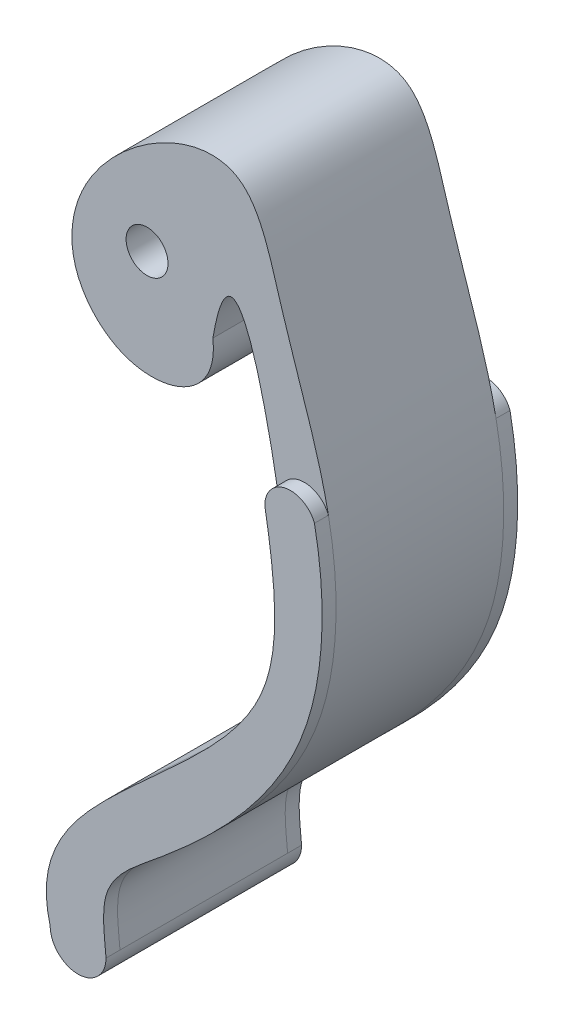
ISO-10303-21;
HEADER;
FILE_DESCRIPTION(('STEP AP214'),'2;1');
FILE_NAME('part.step','',(''),(''),'','','');
FILE_SCHEMA(('AUTOMOTIVE_DESIGN { 1 0 10303 214 1 1 1 1 }'));
ENDSEC;
DATA;
#1=APPLICATION_CONTEXT('core data for automotive mechanical design processes');
#2=APPLICATION_PROTOCOL_DEFINITION('international standard','automotive_design',2000,#1);
#3=PRODUCT_CONTEXT('',#1,'mechanical');
#4=PRODUCT('Part','Part','',(#3));
#5=PRODUCT_RELATED_PRODUCT_CATEGORY('part','',(#4));
#6=PRODUCT_DEFINITION_FORMATION('','',#4);
#7=PRODUCT_DEFINITION_CONTEXT('part definition',#1,'design');
#8=PRODUCT_DEFINITION('design','',#6,#7);
#9=PRODUCT_DEFINITION_SHAPE('','',#8);
#10=(LENGTH_UNIT() NAMED_UNIT(*) SI_UNIT(.MILLI.,.METRE.));
#11=(NAMED_UNIT(*) PLANE_ANGLE_UNIT() SI_UNIT($,.RADIAN.));
#12=(NAMED_UNIT(*) SI_UNIT($,.STERADIAN.) SOLID_ANGLE_UNIT());
#13=UNCERTAINTY_MEASURE_WITH_UNIT(LENGTH_MEASURE(1.E-05),#10,'distance_accuracy_value','');
#14=(GEOMETRIC_REPRESENTATION_CONTEXT(3) GLOBAL_UNCERTAINTY_ASSIGNED_CONTEXT((#13)) GLOBAL_UNIT_ASSIGNED_CONTEXT((#10,
#11,#12)) REPRESENTATION_CONTEXT('',''));
#15=CARTESIAN_POINT('',(0.,0.,0.));
#16=DIRECTION('',(0.,0.,1.));
#17=DIRECTION('',(1.,0.,0.));
#18=AXIS2_PLACEMENT_3D('',#15,#16,#17);
#19=CARTESIAN_POINT('',(8.65256154286827,41.2662872766551,11.9999999999999));
#20=CARTESIAN_POINT('',(9.10118209607456,37.4247396513249,11.9999999999999));
#21=CARTESIAN_POINT('',(3.28528745082989,35.2364508834655,11.9999999999999));
#22=CARTESIAN_POINT('',(-2.16410396939319,40.5397500064075,11.9999999999998));
#23=CARTESIAN_POINT('',(-0.766840168642913,48.981252926085,11.9999999999999));
#24=CARTESIAN_POINT('',(10.8230790933583,55.5956846813032,11.9999999999999));
#25=CARTESIAN_POINT('',(13.2552931019139,46.3870949652313,11.9999999999999));
#26=CARTESIAN_POINT('',(15.2399861624646,40.5537918312876,11.9999999999999));
#27=CARTESIAN_POINT('',(17.86045277101,32.4214527266858,11.9999999999999));
#28=CARTESIAN_POINT('',(17.3867748609505,19.0552244310405,12.));
#29=CARTESIAN_POINT('',(8.96857962727781,10.4709740297987,11.9999999999999));
#30=CARTESIAN_POINT('',(1.34504598361626,4.60786521100223,11.9999999999999));
#31=CARTESIAN_POINT('',(1.90219914305774,1.21580565088503,11.9999999999999));
#32=CARTESIAN_POINT('',(2.00000000000004,0.,11.9999999999998));
#33=B_SPLINE_CURVE_WITH_KNOTS('',3,(#19,#20,#21,#22,#23,#24,#25,#26,#27,#28,#29,#30,#31,#32),
.UNSPECIFIED.,.F.,.F.,(4,1,1,1,1,1,1,1,1,1,1,4),(0.,0.0967638482671301,0.147229163988241,
0.224573311805362,0.354095968697292,0.424863733171627,0.483157365268735,0.569429769338486,
0.705070573129019,0.901237067107306,0.956019997067869,1.),.UNSPECIFIED.);
#34=DIRECTION('',(0.,0.,-0.999999999999998));
#35=VECTOR('',#34,1.);
#36=SURFACE_OF_LINEAR_EXTRUSION('',#33,#35);
#37=CARTESIAN_POINT('',(8.65256154286827,41.2662872766551,0.));
#38=CARTESIAN_POINT('',(9.10118209607455,37.4247396513249,0.));
#39=CARTESIAN_POINT('',(3.28528745082989,35.2364508834655,0.));
#40=CARTESIAN_POINT('',(-2.16410396939319,40.5397500064075,0.));
#41=CARTESIAN_POINT('',(-0.766840168642879,48.981252926085,0.));
#42=CARTESIAN_POINT('',(10.8230790933583,55.5956846813032,0.));
#43=CARTESIAN_POINT('',(13.255293101914,46.3870949652313,-1.11022302462516E-13));
#44=CARTESIAN_POINT('',(15.2399861624646,40.5537918312876,0.));
#45=CARTESIAN_POINT('',(17.86045277101,32.4214527266858,0.));
#46=CARTESIAN_POINT('',(17.3867748609505,19.0552244310405,0.));
#47=CARTESIAN_POINT('',(8.9685796272778,10.4709740297987,0.));
#48=CARTESIAN_POINT('',(1.34504598361626,4.60786521100226,0.));
#49=CARTESIAN_POINT('',(1.90219914305772,1.21580565088503,0.));
#50=CARTESIAN_POINT('',(2.00000000000003,0.,0.));
#51=B_SPLINE_CURVE_WITH_KNOTS('',3,(#37,#38,#39,#40,#41,#42,#43,#44,#45,#46,#47,#48,#49,#50),
.UNSPECIFIED.,.F.,.F.,(4,1,1,1,1,1,1,1,1,1,1,4),(0.,0.0967638482671301,0.147229163988241,
0.224573311805362,0.354095968697292,0.424863733171627,0.483157365268735,0.569429769338486,
0.705070573129019,0.901237067107306,0.956019997067869,1.),.UNSPECIFIED.);
#52=CARTESIAN_POINT('',(8.65256154286827,41.2662872766551,0.));
#53=VERTEX_POINT('',#52);
#54=CARTESIAN_POINT('',(16.92312111311,34.4195411326855,-1.38777878078145E-13));
#55=VERTEX_POINT('',#54);
#56=EDGE_CURVE('E213',#53,#55,#51,.T.);
#57=ORIENTED_EDGE('',*,*,#56,.F.);
#58=DIRECTION('',(0.,0.,-0.999999999999998));
#59=VECTOR('',#58,1.);
#60=CARTESIAN_POINT('',(8.65256154286827,41.2662872766551,11.9999999999999));
#61=LINE('',#60,#59);
#62=CARTESIAN_POINT('',(8.65256154286827,41.2662872766551,11.9999999999999));
#63=VERTEX_POINT('',#62);
#64=EDGE_CURVE('E13',#63,#53,#61,.T.);
#65=ORIENTED_EDGE('',*,*,#64,.F.);
#66=CARTESIAN_POINT('',(16.92312111311,34.4195411326855,11.9999999999999));
#67=VERTEX_POINT('',#66);
#68=EDGE_CURVE('E218',#63,#67,#33,.T.);
#69=ORIENTED_EDGE('',*,*,#68,.T.);
#70=CARTESIAN_POINT('',(16.92312111311,34.4195411326855,11.9999999999999));
#71=CARTESIAN_POINT('',(16.9668608202732,34.1988748763239,12.));
#72=CARTESIAN_POINT('',(17.7710486743882,29.8986507539403,11.9999999999999));
#73=CARTESIAN_POINT('',(17.3867748609535,19.0552244310254,11.9999999999999));
#74=CARTESIAN_POINT('',(8.96857962727752,10.4709740297999,12.));
#75=CARTESIAN_POINT('',(1.34504598361629,4.60786521100209,11.9999999999999));
#76=CARTESIAN_POINT('',(1.90219914305775,1.21580565088508,11.9999999999999));
#77=CARTESIAN_POINT('',(2.00000000000004,0.,11.9999999999998));
#78=B_SPLINE_CURVE_WITH_KNOTS('',3,(#70,#71,#72,#73,#74,#75,#76,#77),.UNSPECIFIED.,.F.,.F.,(4,1,
1,1,1,4),(0.562067606306298,0.569429769338486,0.705070573129019,0.901237067107306,
0.956019997067869,1.),.UNSPECIFIED.);
#79=CARTESIAN_POINT('',(2.00000000000004,0.,11.9999999999998));
#80=VERTEX_POINT('',#79);
#81=EDGE_CURVE('E155',#67,#80,#78,.T.);
#82=ORIENTED_EDGE('',*,*,#81,.T.);
#83=DIRECTION('',(0.,0.,-0.999999999999998));
#84=VECTOR('',#83,1.);
#85=CARTESIAN_POINT('',(2.00000000000004,0.,11.9999999999998));
#86=LINE('',#85,#84);
#87=CARTESIAN_POINT('',(2.00000000000003,0.,0.));
#88=VERTEX_POINT('',#87);
#89=EDGE_CURVE('E144',#80,#88,#86,.T.);
#90=ORIENTED_EDGE('',*,*,#89,.T.);
#91=CARTESIAN_POINT('',(16.92312111311,34.4195411326855,-1.38777878078145E-13));
#92=CARTESIAN_POINT('',(16.9668608202732,34.1988748763239,0.));
#93=CARTESIAN_POINT('',(17.7710486743881,29.8986507539403,-1.11022302462516E-13));
#94=CARTESIAN_POINT('',(17.3867748609535,19.0552244310254,-1.11022302462516E-13));
#95=CARTESIAN_POINT('',(8.96857962727754,10.4709740297999,0.));
#96=CARTESIAN_POINT('',(1.34504598361632,4.60786521100209,0.));
#97=CARTESIAN_POINT('',(1.90219914305772,1.2158056508851,0.));
#98=CARTESIAN_POINT('',(2.00000000000003,0.,0.));
#99=B_SPLINE_CURVE_WITH_KNOTS('',3,(#91,#92,#93,#94,#95,#96,#97,#98),.UNSPECIFIED.,.F.,.F.,(4,1,
1,1,1,4),(0.562067606306298,0.569429769338486,0.705070573129019,0.901237067107306,
0.956019997067869,1.),.UNSPECIFIED.);
#100=EDGE_CURVE('E199',#55,#88,#99,.T.);
#101=ORIENTED_EDGE('',*,*,#100,.F.);
#102=EDGE_LOOP('',(#57,#65,#69,#82,#90,#101));
#103=FACE_BOUND('',#102,.T.);
#104=ADVANCED_FACE('F52',(#103),#36,.T.);
#105=CARTESIAN_POINT('',(-1.99999999999997,0.,12.));
#106=CARTESIAN_POINT('',(-3.14094019365851,4.21599928477223,11.9999999999999));
#107=CARTESIAN_POINT('',(2.89729936693877,11.4588662737259,12.));
#108=CARTESIAN_POINT('',(14.6453699190701,20.2351922359558,11.9999999999999));
#109=CARTESIAN_POINT('',(14.1319176735092,32.4953004574275,12.));
#110=CARTESIAN_POINT('',(10.0181578199574,49.4039756935857,12.));
#111=CARTESIAN_POINT('',(8.65256154286827,41.2662872766551,11.9999999999999));
#112=B_SPLINE_CURVE_WITH_KNOTS('',3,(#105,#106,#107,#108,#109,#110,#111),.UNSPECIFIED.,.F.,.F.,
(4,1,1,1,4),(0.,0.216144602550126,0.503172390505124,0.73063678352281,1.),.UNSPECIFIED.);
#113=DIRECTION('',(0.,0.,-0.999999999999998));
#114=VECTOR('',#113,1.);
#115=SURFACE_OF_LINEAR_EXTRUSION('',#112,#114);
#116=CARTESIAN_POINT('',(-1.99999999999997,0.,-1.11022302462516E-13));
#117=CARTESIAN_POINT('',(-3.14094019365852,4.21599928477224,-1.38777878078145E-13));
#118=CARTESIAN_POINT('',(2.89729936693879,11.4588662737259,0.));
#119=CARTESIAN_POINT('',(14.6453699190701,20.2351922359557,-1.38777878078145E-13));
#120=CARTESIAN_POINT('',(14.1319176735092,32.4953004574275,0.));
#121=CARTESIAN_POINT('',(10.0181578199574,49.4039756935856,0.));
#122=CARTESIAN_POINT('',(8.65256154286827,41.2662872766551,0.));
#123=B_SPLINE_CURVE_WITH_KNOTS('',3,(#116,#117,#118,#119,#120,#121,#122),.UNSPECIFIED.,.F.,.F.,
(4,1,1,1,4),(0.,0.216144602550126,0.503172390505124,0.73063678352281,1.),.UNSPECIFIED.);
#124=CARTESIAN_POINT('',(-1.99999999999997,0.,-1.11022302462516E-13));
#125=VERTEX_POINT('',#124);
#126=CARTESIAN_POINT('',(13.3652867250912,33.7553815174871,0.));
#127=VERTEX_POINT('',#126);
#128=EDGE_CURVE('E76',#125,#127,#123,.T.);
#129=ORIENTED_EDGE('',*,*,#128,.F.);
#130=DIRECTION('',(0.,0.,-0.999999999999998));
#131=VECTOR('',#130,1.);
#132=CARTESIAN_POINT('',(-1.99999999999997,0.,12.));
#133=LINE('',#132,#131);
#134=CARTESIAN_POINT('',(-1.99999999999997,0.,12.));
#135=VERTEX_POINT('',#134);
#136=EDGE_CURVE('E61',#135,#125,#133,.T.);
#137=ORIENTED_EDGE('',*,*,#136,.F.);
#138=CARTESIAN_POINT('',(13.3652867250913,33.7553815174871,11.9999999999999));
#139=VERTEX_POINT('',#138);
#140=EDGE_CURVE('E224',#135,#139,#112,.T.);
#141=ORIENTED_EDGE('',*,*,#140,.T.);
#142=EDGE_CURVE('E223',#139,#63,#112,.T.);
#143=ORIENTED_EDGE('',*,*,#142,.T.);
#144=ORIENTED_EDGE('',*,*,#64,.T.);
#145=EDGE_CURVE('E283',#127,#53,#123,.T.);
#146=ORIENTED_EDGE('',*,*,#145,.F.);
#147=EDGE_LOOP('',(#129,#137,#141,#143,#144,#146));
#148=FACE_BOUND('',#147,.T.);
#149=ADVANCED_FACE('F238',(#148),#115,.T.);
#150=CARTESIAN_POINT('',(0.,0.,11.9999999999999));
#151=DIRECTION('',(0.,0.,-0.999999999999998));
#152=DIRECTION('',(-1.,0.,0.));
#153=AXIS2_PLACEMENT_3D('',#150,#151,#152);
#154=CYLINDRICAL_SURFACE('',#153,2.);
#155=ORIENTED_EDGE('',*,*,#136,.T.);
#156=DIRECTION('',(0.,0.,0.999999999999998));
#157=VECTOR('',#156,1.);
#158=CARTESIAN_POINT('',(-1.99999999999997,0.,-1.00000000000006));
#159=LINE('',#158,#157);
#160=CARTESIAN_POINT('',(-1.99999999999997,0.,-1.00000000000006));
#161=VERTEX_POINT('',#160);
#162=EDGE_CURVE('E214',#161,#125,#159,.T.);
#163=ORIENTED_EDGE('',*,*,#162,.F.);
#164=CARTESIAN_POINT('',(0.,0.,-1.00000000000008));
#165=DIRECTION('',(0.,0.,0.999999999999998));
#166=DIRECTION('',(1.,0.,0.));
#167=AXIS2_PLACEMENT_3D('',#164,#165,#166);
#168=CIRCLE('',#167,2.);
#169=CARTESIAN_POINT('',(2.00000000000003,0.,-1.00000000000006));
#170=VERTEX_POINT('',#169);
#171=EDGE_CURVE('E190',#161,#170,#168,.T.);
#172=ORIENTED_EDGE('',*,*,#171,.T.);
#173=DIRECTION('',(0.,0.,0.999999999999998));
#174=VECTOR('',#173,1.);
#175=CARTESIAN_POINT('',(2.00000000000003,0.,-1.00000000000006));
#176=LINE('',#175,#174);
#177=EDGE_CURVE('E211',#170,#88,#176,.T.);
#178=ORIENTED_EDGE('',*,*,#177,.T.);
#179=ORIENTED_EDGE('',*,*,#89,.F.);
#180=DIRECTION('',(0.,0.,-0.999999999999998));
#181=VECTOR('',#180,1.);
#182=CARTESIAN_POINT('',(2.00000000000006,0.,12.9999999999999));
#183=LINE('',#182,#181);
#184=CARTESIAN_POINT('',(2.00000000000006,0.,12.9999999999999));
#185=VERTEX_POINT('',#184);
#186=EDGE_CURVE('E140',#185,#80,#183,.T.);
#187=ORIENTED_EDGE('',*,*,#186,.F.);
#188=CARTESIAN_POINT('',(0.,0.,12.9999999999999));
#189=DIRECTION('',(0.,0.,0.999999999999998));
#190=DIRECTION('',(1.,0.,0.));
#191=AXIS2_PLACEMENT_3D('',#188,#189,#190);
#192=CIRCLE('',#191,2.);
#193=CARTESIAN_POINT('',(-1.99999999999995,0.,12.9999999999999));
#194=VERTEX_POINT('',#193);
#195=EDGE_CURVE('E128',#194,#185,#192,.T.);
#196=ORIENTED_EDGE('',*,*,#195,.F.);
#197=DIRECTION('',(0.,0.,-0.999999999999998));
#198=VECTOR('',#197,1.);
#199=CARTESIAN_POINT('',(-1.99999999999995,0.,12.9999999999999));
#200=LINE('',#199,#198);
#201=EDGE_CURVE('E147',#194,#135,#200,.T.);
#202=ORIENTED_EDGE('',*,*,#201,.T.);
#203=EDGE_LOOP('',(#155,#163,#172,#178,#179,#187,#196,#202));
#204=FACE_BOUND('',#203,.T.);
#205=ADVANCED_FACE('F142',(#204),#154,.T.);
#206=CARTESIAN_POINT('',(0.,0.,11.9999999999999));
#207=DIRECTION('',(0.,0.,0.999999999999998));
#208=DIRECTION('',(1.,0.,0.));
#209=AXIS2_PLACEMENT_3D('',#206,#207,#208);
#210=PLANE('',#209);
#211=CARTESIAN_POINT('',(3.93743851983308,44.2868002055946,11.9999999999999));
#212=DIRECTION('',(0.,0.,0.999999999999998));
#213=DIRECTION('',(1.,0.,0.));
#214=AXIS2_PLACEMENT_3D('',#211,#212,#213);
#215=CIRCLE('',#214,1.5);
#216=CARTESIAN_POINT('',(2.43743851983306,44.2868002055946,11.9999999999999));
#217=VERTEX_POINT('',#216);
#218=EDGE_CURVE('E161',#217,#217,#215,.F.);
#219=ORIENTED_EDGE('',*,*,#218,.T.);
#220=EDGE_LOOP('',(#219));
#221=FACE_BOUND('',#220,.T.);
#222=CARTESIAN_POINT('',(15.2061949993972,33.7553815174883,11.9999999999999));
#223=DIRECTION('',(0.,0.,0.999999999999998));
#224=DIRECTION('',(1.,0.,0.));
#225=AXIS2_PLACEMENT_3D('',#222,#223,#224);
#226=CIRCLE('',#225,1.84090827430589);
#227=EDGE_CURVE('E68',#67,#139,#226,.T.);
#228=ORIENTED_EDGE('',*,*,#227,.F.);
#229=ORIENTED_EDGE('',*,*,#68,.F.);
#230=ORIENTED_EDGE('',*,*,#142,.F.);
#231=EDGE_LOOP('',(#228,#229,#230));
#232=FACE_BOUND('',#231,.T.);
#233=ADVANCED_FACE('F244',(#221,#232),#210,.T.);
#234=CARTESIAN_POINT('',(0.,0.,0.));
#235=DIRECTION('',(0.,0.,0.999999999999998));
#236=DIRECTION('',(1.,0.,0.));
#237=AXIS2_PLACEMENT_3D('',#234,#235,#236);
#238=PLANE('',#237);
#239=CARTESIAN_POINT('',(3.93743851983303,44.2868002055946,0.));
#240=DIRECTION('',(0.,0.,0.999999999999998));
#241=DIRECTION('',(1.,0.,0.));
#242=AXIS2_PLACEMENT_3D('',#239,#240,#241);
#243=CIRCLE('',#242,1.5);
#244=CARTESIAN_POINT('',(2.43743851983306,44.2868002055946,0.));
#245=VERTEX_POINT('',#244);
#246=EDGE_CURVE('E56',#245,#245,#243,.F.);
#247=ORIENTED_EDGE('',*,*,#246,.F.);
#248=EDGE_LOOP('',(#247));
#249=FACE_BOUND('',#248,.T.);
#250=ORIENTED_EDGE('',*,*,#56,.T.);
#251=CARTESIAN_POINT('',(15.2061949993972,33.7553815174883,-1.38777878078145E-13));
#252=DIRECTION('',(0.,0.,0.999999999999998));
#253=DIRECTION('',(1.,0.,0.));
#254=AXIS2_PLACEMENT_3D('',#251,#252,#253);
#255=CIRCLE('',#254,1.84090827430589);
#256=EDGE_CURVE('E204',#55,#127,#255,.T.);
#257=ORIENTED_EDGE('',*,*,#256,.T.);
#258=ORIENTED_EDGE('',*,*,#145,.T.);
#259=EDGE_LOOP('',(#250,#257,#258));
#260=FACE_BOUND('',#259,.T.);
#261=ADVANCED_FACE('F245',(#249,#260),#238,.F.);
#262=CARTESIAN_POINT('',(16.92312111311,34.4195411326855,-1.00000000000011));
#263=CARTESIAN_POINT('',(16.9668608202732,34.1988748763239,-1.00000000000006));
#264=CARTESIAN_POINT('',(17.7710486743882,29.8986507539402,-1.00000000000006));
#265=CARTESIAN_POINT('',(17.3867748609535,19.0552244310254,-1.00000000000006));
#266=CARTESIAN_POINT('',(8.96857962727755,10.4709740297999,-1.00000000000003));
#267=CARTESIAN_POINT('',(1.3450459836163,4.60786521100209,-1.00000000000006));
#268=CARTESIAN_POINT('',(1.90219914305775,1.21580565088511,-1.00000000000008));
#269=CARTESIAN_POINT('',(2.00000000000003,0.,-1.00000000000006));
#270=B_SPLINE_CURVE_WITH_KNOTS('',3,(#262,#263,#264,#265,#266,#267,#268,#269),.UNSPECIFIED.,.F.,
.F.,(4,1,1,1,1,4),(0.562067606306298,0.569429769338486,0.705070573129019,0.901237067107306,
0.956019997067869,1.),.UNSPECIFIED.);
#271=DIRECTION('',(0.,0.,0.999999999999998));
#272=VECTOR('',#271,1.);
#273=SURFACE_OF_LINEAR_EXTRUSION('',#270,#272);
#274=ORIENTED_EDGE('',*,*,#100,.T.);
#275=ORIENTED_EDGE('',*,*,#177,.F.);
#276=CARTESIAN_POINT('',(16.92312111311,34.4195411326855,-1.00000000000011));
#277=VERTEX_POINT('',#276);
#278=EDGE_CURVE('E210',#277,#170,#270,.T.);
#279=ORIENTED_EDGE('',*,*,#278,.F.);
#280=DIRECTION('',(0.,0.,0.999999999999998));
#281=VECTOR('',#280,1.);
#282=CARTESIAN_POINT('',(16.92312111311,34.4195411326855,-1.00000000000011));
#283=LINE('',#282,#281);
#284=EDGE_CURVE('E198',#277,#55,#283,.T.);
#285=ORIENTED_EDGE('',*,*,#284,.T.);
#286=EDGE_LOOP('',(#274,#275,#279,#285));
#287=FACE_BOUND('',#286,.T.);
#288=ADVANCED_FACE('F182',(#287),#273,.F.);
#289=CARTESIAN_POINT('',(-1.99999999999997,0.,-1.00000000000006));
#290=CARTESIAN_POINT('',(-3.14094019365846,4.21599928477167,-1.00000000000006));
#291=CARTESIAN_POINT('',(2.89729936693829,11.4588662737291,-1.00000000000011));
#292=CARTESIAN_POINT('',(14.6453699190677,20.2351922359404,-1.00000000000003));
#293=CARTESIAN_POINT('',(14.3083598448832,28.2822501988861,-1.00000000000006));
#294=CARTESIAN_POINT('',(13.3652867250913,33.7553815174872,-1.00000000000008));
#295=B_SPLINE_CURVE_WITH_KNOTS('',3,(#289,#290,#291,#292,#293,#294),.UNSPECIFIED.,.F.,.F.,(4,1,
1,4),(0.,0.216144602550126,0.503172390505124,0.730636783522535),.UNSPECIFIED.);
#296=DIRECTION('',(0.,0.,0.999999999999998));
#297=VECTOR('',#296,1.);
#298=SURFACE_OF_LINEAR_EXTRUSION('',#295,#297);
#299=ORIENTED_EDGE('',*,*,#128,.T.);
#300=DIRECTION('',(0.,0.,0.999999999999998));
#301=VECTOR('',#300,1.);
#302=CARTESIAN_POINT('',(13.3652867250913,33.7553815174872,-1.00000000000008));
#303=LINE('',#302,#301);
#304=CARTESIAN_POINT('',(13.3652867250913,33.7553815174872,-1.00000000000008));
#305=VERTEX_POINT('',#304);
#306=EDGE_CURVE('E216',#305,#127,#303,.T.);
#307=ORIENTED_EDGE('',*,*,#306,.F.);
#308=EDGE_CURVE('E184',#161,#305,#295,.T.);
#309=ORIENTED_EDGE('',*,*,#308,.F.);
#310=ORIENTED_EDGE('',*,*,#162,.T.);
#311=EDGE_LOOP('',(#299,#307,#309,#310));
#312=FACE_BOUND('',#311,.T.);
#313=ADVANCED_FACE('F178',(#312),#298,.F.);
#314=CARTESIAN_POINT('',(15.2061949993972,33.7553815174883,-1.00000000000008));
#315=DIRECTION('',(0.,0.,0.999999999999998));
#316=DIRECTION('',(1.,0.,0.));
#317=AXIS2_PLACEMENT_3D('',#314,#315,#316);
#318=CYLINDRICAL_SURFACE('',#317,1.84090827430589);
#319=ORIENTED_EDGE('',*,*,#256,.F.);
#320=ORIENTED_EDGE('',*,*,#284,.F.);
#321=CARTESIAN_POINT('',(15.2061949993972,33.7553815174883,-1.00000000000008));
#322=DIRECTION('',(0.,0.,0.999999999999998));
#323=DIRECTION('',(1.,0.,0.));
#324=AXIS2_PLACEMENT_3D('',#321,#322,#323);
#325=CIRCLE('',#324,1.84090827430589);
#326=EDGE_CURVE('E191',#277,#305,#325,.T.);
#327=ORIENTED_EDGE('',*,*,#326,.T.);
#328=ORIENTED_EDGE('',*,*,#306,.T.);
#329=EDGE_LOOP('',(#319,#320,#327,#328));
#330=FACE_BOUND('',#329,.T.);
#331=ADVANCED_FACE('F176',(#330),#318,.T.);
#332=CARTESIAN_POINT('',(0.,0.,-1.00000000000008));
#333=DIRECTION('',(0.,0.,0.999999999999998));
#334=DIRECTION('',(1.,0.,0.));
#335=AXIS2_PLACEMENT_3D('',#332,#333,#334);
#336=PLANE('',#335);
#337=ORIENTED_EDGE('',*,*,#278,.T.);
#338=ORIENTED_EDGE('',*,*,#171,.F.);
#339=ORIENTED_EDGE('',*,*,#308,.T.);
#340=ORIENTED_EDGE('',*,*,#326,.F.);
#341=EDGE_LOOP('',(#337,#338,#339,#340));
#342=FACE_BOUND('',#341,.T.);
#343=ADVANCED_FACE('F171',(#342),#336,.F.);
#344=CARTESIAN_POINT('',(16.92312111311,34.4195411326855,12.9999999999999));
#345=CARTESIAN_POINT('',(16.9668608202732,34.198874876324,13.));
#346=CARTESIAN_POINT('',(17.7710486743882,29.8986507539403,12.9999999999999));
#347=CARTESIAN_POINT('',(17.3867748609535,19.0552244310254,12.9999999999999));
#348=CARTESIAN_POINT('',(8.96857962727751,10.4709740297999,12.9999999999999));
#349=CARTESIAN_POINT('',(1.34504598361627,4.60786521100208,12.9999999999999));
#350=CARTESIAN_POINT('',(1.90219914305773,1.21580565088508,12.9999999999999));
#351=CARTESIAN_POINT('',(2.00000000000006,0.,12.9999999999999));
#352=B_SPLINE_CURVE_WITH_KNOTS('',3,(#344,#345,#346,#347,#348,#349,#350,#351),.UNSPECIFIED.,.F.,
.F.,(4,1,1,1,1,4),(0.562067606306298,0.569429769338486,0.705070573129019,0.901237067107306,
0.956019997067869,1.),.UNSPECIFIED.);
#353=DIRECTION('',(0.,0.,-0.999999999999998));
#354=VECTOR('',#353,1.);
#355=SURFACE_OF_LINEAR_EXTRUSION('',#352,#354);
#356=ORIENTED_EDGE('',*,*,#81,.F.);
#357=DIRECTION('',(0.,0.,-0.999999999999998));
#358=VECTOR('',#357,1.);
#359=CARTESIAN_POINT('',(16.92312111311,34.4195411326855,12.9999999999999));
#360=LINE('',#359,#358);
#361=CARTESIAN_POINT('',(16.92312111311,34.4195411326855,12.9999999999999));
#362=VERTEX_POINT('',#361);
#363=EDGE_CURVE('E152',#362,#67,#360,.T.);
#364=ORIENTED_EDGE('',*,*,#363,.F.);
#365=EDGE_CURVE('E132',#362,#185,#352,.T.);
#366=ORIENTED_EDGE('',*,*,#365,.T.);
#367=ORIENTED_EDGE('',*,*,#186,.T.);
#368=EDGE_LOOP('',(#356,#364,#366,#367));
#369=FACE_BOUND('',#368,.T.);
#370=ADVANCED_FACE('F150',(#369),#355,.T.);
#371=CARTESIAN_POINT('',(15.2061949993972,33.7553815174883,12.9999999999999));
#372=DIRECTION('',(0.,0.,-0.999999999999998));
#373=DIRECTION('',(-1.,0.,0.));
#374=AXIS2_PLACEMENT_3D('',#371,#372,#373);
#375=CYLINDRICAL_SURFACE('',#374,1.84090827430589);
#376=ORIENTED_EDGE('',*,*,#227,.T.);
#377=DIRECTION('',(0.,0.,-0.999999999999998));
#378=VECTOR('',#377,1.);
#379=CARTESIAN_POINT('',(13.3652867250913,33.7553815174872,12.9999999999998));
#380=LINE('',#379,#378);
#381=CARTESIAN_POINT('',(13.3652867250913,33.7553815174872,12.9999999999998));
#382=VERTEX_POINT('',#381);
#383=EDGE_CURVE('E261',#382,#139,#380,.T.);
#384=ORIENTED_EDGE('',*,*,#383,.F.);
#385=CARTESIAN_POINT('',(15.2061949993972,33.7553815174883,12.9999999999999));
#386=DIRECTION('',(0.,0.,0.999999999999998));
#387=DIRECTION('',(1.,0.,0.));
#388=AXIS2_PLACEMENT_3D('',#385,#386,#387);
#389=CIRCLE('',#388,1.84090827430589);
#390=EDGE_CURVE('E148',#362,#382,#389,.T.);
#391=ORIENTED_EDGE('',*,*,#390,.F.);
#392=ORIENTED_EDGE('',*,*,#363,.T.);
#393=EDGE_LOOP('',(#376,#384,#391,#392));
#394=FACE_BOUND('',#393,.T.);
#395=ADVANCED_FACE('F170',(#394),#375,.T.);
#396=CARTESIAN_POINT('',(-1.99999999999995,0.,12.9999999999999));
#397=CARTESIAN_POINT('',(-3.14094019365841,4.21599928477167,12.9999999999999));
#398=CARTESIAN_POINT('',(2.89729936693827,11.4588662737291,12.9999999999999));
#399=CARTESIAN_POINT('',(14.6453699190677,20.2351922359404,13.));
#400=CARTESIAN_POINT('',(14.3083598448832,28.282250198886,13.));
#401=CARTESIAN_POINT('',(13.3652867250913,33.7553815174872,12.9999999999998));
#402=B_SPLINE_CURVE_WITH_KNOTS('',3,(#396,#397,#398,#399,#400,#401),.UNSPECIFIED.,.F.,.F.,(4,1,
1,4),(0.,0.216144602550126,0.503172390505124,0.730636783522535),.UNSPECIFIED.);
#403=DIRECTION('',(0.,0.,-0.999999999999998));
#404=VECTOR('',#403,1.);
#405=SURFACE_OF_LINEAR_EXTRUSION('',#402,#404);
#406=ORIENTED_EDGE('',*,*,#140,.F.);
#407=ORIENTED_EDGE('',*,*,#201,.F.);
#408=EDGE_CURVE('E134',#194,#382,#402,.T.);
#409=ORIENTED_EDGE('',*,*,#408,.T.);
#410=ORIENTED_EDGE('',*,*,#383,.T.);
#411=EDGE_LOOP('',(#406,#407,#409,#410));
#412=FACE_BOUND('',#411,.T.);
#413=ADVANCED_FACE('F172',(#412),#405,.T.);
#414=CARTESIAN_POINT('',(0.,0.,12.9999999999999));
#415=DIRECTION('',(0.,0.,-0.999999999999998));
#416=DIRECTION('',(1.,0.,0.));
#417=AXIS2_PLACEMENT_3D('',#414,#415,#416);
#418=PLANE('',#417);
#419=ORIENTED_EDGE('',*,*,#365,.F.);
#420=ORIENTED_EDGE('',*,*,#390,.T.);
#421=ORIENTED_EDGE('',*,*,#408,.F.);
#422=ORIENTED_EDGE('',*,*,#195,.T.);
#423=EDGE_LOOP('',(#419,#420,#421,#422));
#424=FACE_BOUND('',#423,.T.);
#425=ADVANCED_FACE('F130',(#424),#418,.F.);
#426=CARTESIAN_POINT('',(3.93743851983306,44.2868002055946,12.9999999999999));
#427=DIRECTION('',(0.,0.,-0.999999999999998));
#428=DIRECTION('',(-1.,0.,0.));
#429=AXIS2_PLACEMENT_3D('',#426,#427,#428);
#430=CYLINDRICAL_SURFACE('',#429,1.5);
#431=CARTESIAN_POINT('',(2.43743851983306,44.2868002055946,11.9999999999999));
#432=CARTESIAN_POINT('',(2.43743851983306,44.2868002055946,11.8749999999999));
#433=CARTESIAN_POINT('',(2.43743851983306,44.2868002055946,11.7499999999999));
#434=CARTESIAN_POINT('',(2.43743851983306,44.2868002055946,11.4999999999999));
#435=CARTESIAN_POINT('',(2.43743851983306,44.2868002055946,11.3749999999999));
#436=CARTESIAN_POINT('',(2.43743851983306,44.2868002055946,11.1249999999999));
#437=CARTESIAN_POINT('',(2.43743851983306,44.2868002055946,10.9999999999999));
#438=CARTESIAN_POINT('',(2.43743851983306,44.2868002055946,10.7499999999999));
#439=CARTESIAN_POINT('',(2.43743851983306,44.2868002055946,10.6249999999999));
#440=CARTESIAN_POINT('',(2.43743851983306,44.2868002055946,10.3749999999999));
#441=CARTESIAN_POINT('',(2.43743851983306,44.2868002055946,10.2499999999999));
#442=CARTESIAN_POINT('',(2.43743851983306,44.2868002055946,9.9999999999999));
#443=CARTESIAN_POINT('',(2.43743851983306,44.2868002055946,9.8749999999999));
#444=CARTESIAN_POINT('',(2.43743851983306,44.2868002055946,9.6249999999999));
#445=CARTESIAN_POINT('',(2.43743851983306,44.2868002055946,9.4999999999999));
#446=CARTESIAN_POINT('',(2.43743851983306,44.2868002055946,9.2499999999999));
#447=CARTESIAN_POINT('',(2.43743851983306,44.2868002055946,9.1249999999999));
#448=CARTESIAN_POINT('',(2.43743851983306,44.2868002055946,8.8749999999999));
#449=CARTESIAN_POINT('',(2.43743851983306,44.2868002055946,8.74999999999991));
#450=CARTESIAN_POINT('',(2.43743851983306,44.2868002055946,8.49999999999991));
#451=CARTESIAN_POINT('',(2.43743851983306,44.2868002055946,8.37499999999991));
#452=CARTESIAN_POINT('',(2.43743851983306,44.2868002055946,8.12499999999991));
#453=CARTESIAN_POINT('',(2.43743851983306,44.2868002055946,7.99999999999991));
#454=CARTESIAN_POINT('',(2.43743851983306,44.2868002055946,7.74999999999991));
#455=CARTESIAN_POINT('',(2.43743851983306,44.2868002055946,7.62499999999991));
#456=CARTESIAN_POINT('',(2.43743851983306,44.2868002055946,7.37499999999991));
#457=CARTESIAN_POINT('',(2.43743851983306,44.2868002055946,7.24999999999991));
#458=CARTESIAN_POINT('',(2.43743851983306,44.2868002055946,6.99999999999991));
#459=CARTESIAN_POINT('',(2.43743851983306,44.2868002055946,6.87499999999991));
#460=CARTESIAN_POINT('',(2.43743851983306,44.2868002055946,6.62499999999991));
#461=CARTESIAN_POINT('',(2.43743851983306,44.2868002055946,6.49999999999991));
#462=CARTESIAN_POINT('',(2.43743851983306,44.2868002055946,6.24999999999991));
#463=CARTESIAN_POINT('',(2.43743851983306,44.2868002055946,6.12499999999991));
#464=CARTESIAN_POINT('',(2.43743851983306,44.2868002055946,5.87499999999991));
#465=CARTESIAN_POINT('',(2.43743851983306,44.2868002055946,5.74999999999991));
#466=CARTESIAN_POINT('',(2.43743851983306,44.2868002055946,5.49999999999991));
#467=CARTESIAN_POINT('',(2.43743851983306,44.2868002055946,5.37499999999991));
#468=CARTESIAN_POINT('',(2.43743851983306,44.2868002055946,5.12499999999991));
#469=CARTESIAN_POINT('',(2.43743851983306,44.2868002055946,4.99999999999991));
#470=CARTESIAN_POINT('',(2.43743851983306,44.2868002055946,4.74999999999991));
#471=CARTESIAN_POINT('',(2.43743851983306,44.2868002055946,4.62499999999991));
#472=CARTESIAN_POINT('',(2.43743851983306,44.2868002055946,4.37499999999991));
#473=CARTESIAN_POINT('',(2.43743851983306,44.2868002055946,4.24999999999991));
#474=CARTESIAN_POINT('',(2.43743851983306,44.2868002055946,3.99999999999991));
#475=CARTESIAN_POINT('',(2.43743851983306,44.2868002055946,3.87499999999991));
#476=CARTESIAN_POINT('',(2.43743851983306,44.2868002055946,3.62499999999991));
#477=CARTESIAN_POINT('',(2.43743851983306,44.2868002055946,3.49999999999991));
#478=CARTESIAN_POINT('',(2.43743851983306,44.2868002055946,3.24999999999991));
#479=CARTESIAN_POINT('',(2.43743851983306,44.2868002055946,3.12499999999991));
#480=CARTESIAN_POINT('',(2.43743851983306,44.2868002055946,2.87499999999991));
#481=CARTESIAN_POINT('',(2.43743851983306,44.2868002055946,2.74999999999991));
#482=CARTESIAN_POINT('',(2.43743851983306,44.2868002055946,2.49999999999991));
#483=CARTESIAN_POINT('',(2.43743851983306,44.2868002055946,2.37499999999991));
#484=CARTESIAN_POINT('',(2.43743851983306,44.2868002055946,2.12499999999991));
#485=CARTESIAN_POINT('',(2.43743851983306,44.2868002055946,1.99999999999991));
#486=CARTESIAN_POINT('',(2.43743851983306,44.2868002055946,1.74999999999991));
#487=CARTESIAN_POINT('',(2.43743851983306,44.2868002055946,1.62499999999992));
#488=CARTESIAN_POINT('',(2.43743851983306,44.2868002055946,1.37499999999992));
#489=CARTESIAN_POINT('',(2.43743851983306,44.2868002055946,1.24999999999992));
#490=CARTESIAN_POINT('',(2.43743851983306,44.2868002055946,0.999999999999918));
#491=CARTESIAN_POINT('',(2.43743851983306,44.2868002055946,0.874999999999919));
#492=CARTESIAN_POINT('',(2.43743851983306,44.2868002055946,0.624999999999919));
#493=CARTESIAN_POINT('',(2.43743851983306,44.2868002055946,0.499999999999919));
#494=CARTESIAN_POINT('',(2.43743851983306,44.2868002055946,0.249999999999919));
#495=CARTESIAN_POINT('',(2.43743851983306,44.2868002055946,0.124999999999919));
#496=CARTESIAN_POINT('',(2.43743851983306,44.2868002055946,0.));
#497=B_SPLINE_CURVE_WITH_KNOTS('',3,(#431,#432,#433,#434,#435,#436,#437,#438,#439,#440,#441,
#442,#443,#444,#445,#446,#447,#448,#449,#450,#451,#452,#453,#454,#455,#456,#457,#458,#459,#460,
#461,#462,#463,#464,#465,#466,#467,#468,#469,#470,#471,#472,#473,#474,#475,#476,#477,#478,#479,
#480,#481,#482,#483,#484,#485,#486,#487,#488,#489,#490,#491,#492,#493,#494,#495,#496),
.UNSPECIFIED.,.F.,.F.,(4,2,2,2,2,2,2,2,2,2,2,2,2,2,2,2,2,2,2,2,2,2,2,2,2,2,2,2,2,2,2,2,4),(0.,
0.374999999999999,0.749999999999997,1.125,1.5,1.875,2.25,2.625,3.,3.37499999999999,
3.74999999999999,4.12499999999999,4.49999999999999,4.87499999999999,5.24999999999999,
5.62499999999999,5.99999999999999,6.37499999999999,6.74999999999999,7.12499999999999,
7.49999999999999,7.87499999999999,8.24999999999999,8.62499999999999,8.99999999999999,
9.37499999999999,9.74999999999999,10.125,10.5,10.875,11.25,11.625,12.),.UNSPECIFIED.);
#498=EDGE_CURVE('BSEAM357',#217,#245,#497,.T.);
#499=ORIENTED_EDGE('',*,*,#218,.F.);
#500=ORIENTED_EDGE('',*,*,#246,.T.);
#501=ORIENTED_EDGE('',*,*,#498,.T.);
#502=ORIENTED_EDGE('',*,*,#498,.F.);
#503=EDGE_LOOP('',(#499,#501,#500,#502));
#504=FACE_BOUND('',#503,.T.);
#505=ADVANCED_FACE('F357',(#504),#430,.F.);
#506=CLOSED_SHELL('',(#104,#149,#205,#233,#261,#288,#313,#331,#343,#370,#395,#413,#425,#505));
#507=MANIFOLD_SOLID_BREP('B2',#506);
#508=ADVANCED_BREP_SHAPE_REPRESENTATION('',(#18,#507),#14);
#509=SHAPE_DEFINITION_REPRESENTATION(#9,#508);
ENDSEC;
END-ISO-10303-21;
